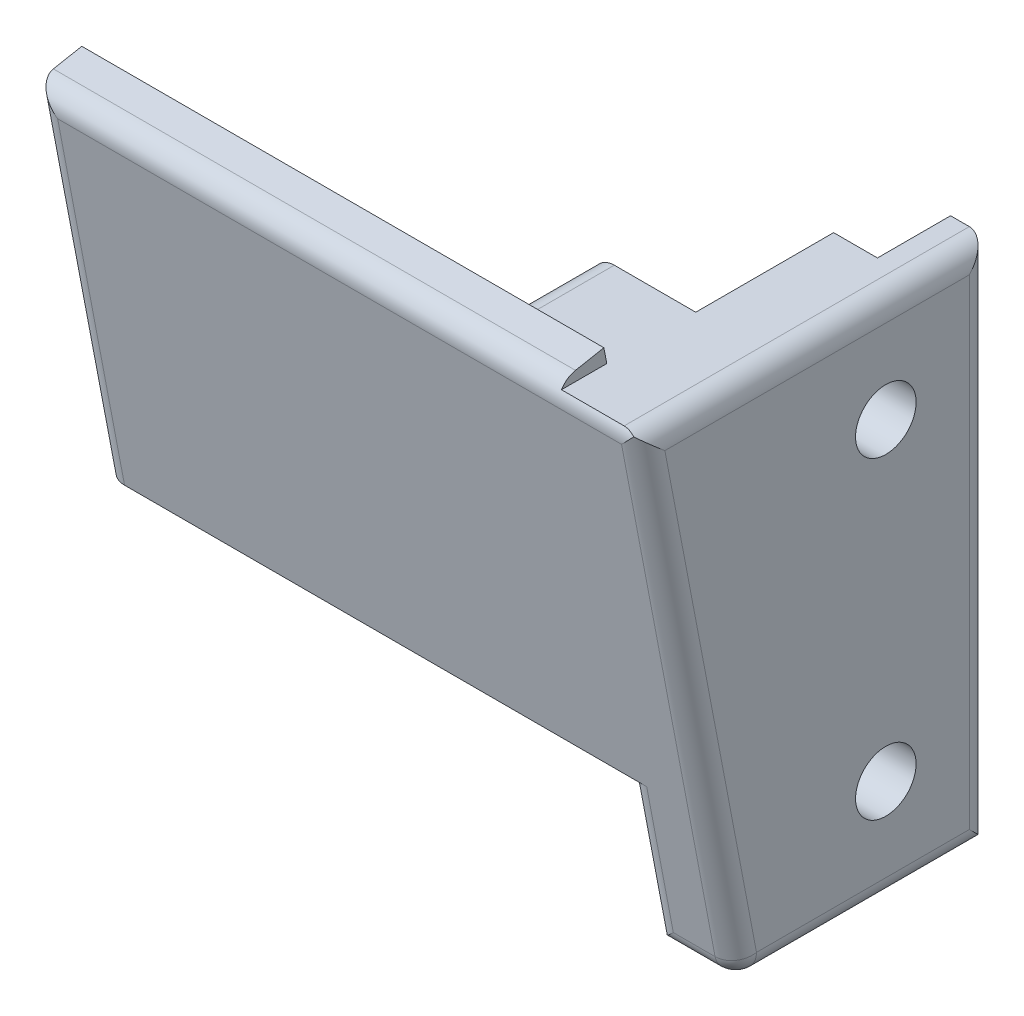
ISO-10303-21;
HEADER;
FILE_DESCRIPTION(('STEP AP214'),'2;1');
FILE_NAME('part.step','',(''),(''),'','','');
FILE_SCHEMA(('AUTOMOTIVE_DESIGN { 1 0 10303 214 1 1 1 1 }'));
ENDSEC;
DATA;
#1=APPLICATION_CONTEXT('core data for automotive mechanical design processes');
#2=APPLICATION_PROTOCOL_DEFINITION('international standard','automotive_design',2000,#1);
#3=PRODUCT_CONTEXT('',#1,'mechanical');
#4=PRODUCT('Part','Part','',(#3));
#5=PRODUCT_RELATED_PRODUCT_CATEGORY('part','',(#4));
#6=PRODUCT_DEFINITION_FORMATION('','',#4);
#7=PRODUCT_DEFINITION_CONTEXT('part definition',#1,'design');
#8=PRODUCT_DEFINITION('design','',#6,#7);
#9=PRODUCT_DEFINITION_SHAPE('','',#8);
#10=(LENGTH_UNIT() NAMED_UNIT(*) SI_UNIT(.MILLI.,.METRE.));
#11=(NAMED_UNIT(*) PLANE_ANGLE_UNIT() SI_UNIT($,.RADIAN.));
#12=(NAMED_UNIT(*) SI_UNIT($,.STERADIAN.) SOLID_ANGLE_UNIT());
#13=UNCERTAINTY_MEASURE_WITH_UNIT(LENGTH_MEASURE(1.E-05),#10,'distance_accuracy_value','');
#14=(GEOMETRIC_REPRESENTATION_CONTEXT(3) GLOBAL_UNCERTAINTY_ASSIGNED_CONTEXT((#13)) GLOBAL_UNIT_ASSIGNED_CONTEXT((#10,
#11,#12)) REPRESENTATION_CONTEXT('',''));
#15=CARTESIAN_POINT('',(0.,0.,0.));
#16=DIRECTION('',(0.,0.,1.));
#17=DIRECTION('',(1.,0.,0.));
#18=AXIS2_PLACEMENT_3D('',#15,#16,#17);
#19=CARTESIAN_POINT('',(50.,0.,0.));
#20=DIRECTION('',(-1.,0.,0.));
#21=DIRECTION('',(0.,0.,1.));
#22=AXIS2_PLACEMENT_3D('',#19,#20,#21);
#23=PLANE('',#22);
#24=DIRECTION('',(0.,-0.187368284578925,0.982289736245855));
#25=VECTOR('',#24,1.);
#26=CARTESIAN_POINT('',(50.,40.,17.6298581840024));
#27=LINE('',#26,#25);
#28=CARTESIAN_POINT('',(50.,41.4553683976997,10.));
#29=VERTEX_POINT('',#28);
#30=CARTESIAN_POINT('',(50.,40.9368414228946,12.7184095027731));
#31=VERTEX_POINT('',#30);
#32=EDGE_CURVE('E298',#29,#31,#27,.T.);
#33=ORIENTED_EDGE('',*,*,#32,.T.);
#34=CARTESIAN_POINT('',(50.,38.9722619504029,12.3436729336153));
#35=DIRECTION('',(-1.,0.,0.));
#36=DIRECTION('',(0.,0.,1.));
#37=AXIS2_PLACEMENT_3D('',#34,#35,#36);
#38=CIRCLE('',#37,2.);
#39=CARTESIAN_POINT('',(50.,40.,14.0594102390937));
#40=VERTEX_POINT('',#39);
#41=EDGE_CURVE('E370',#31,#40,#38,.F.);
#42=ORIENTED_EDGE('',*,*,#41,.T.);
#43=DIRECTION('',(0.,0.,-1.));
#44=VECTOR('',#43,1.);
#45=CARTESIAN_POINT('',(50.,40.,45.456648032545));
#46=LINE('',#45,#44);
#47=CARTESIAN_POINT('',(50.,40.,9.72239363800181));
#48=VERTEX_POINT('',#47);
#49=EDGE_CURVE('E291',#40,#48,#46,.T.);
#50=ORIENTED_EDGE('',*,*,#49,.T.);
#51=DIRECTION('',(0.,0.982289736245855,0.187368284578925));
#52=VECTOR('',#51,1.);
#53=CARTESIAN_POINT('',(50.,41.4553683976997,10.));
#54=LINE('',#53,#52);
#55=EDGE_CURVE('E296',#48,#29,#54,.T.);
#56=ORIENTED_EDGE('',*,*,#55,.T.);
#57=EDGE_LOOP('',(#33,#42,#50,#56));
#58=FACE_BOUND('',#57,.T.);
#59=ADVANCED_FACE('F41',(#58),#23,.F.);
#60=CARTESIAN_POINT('',(50.,40.,17.6298581840024));
#61=DIRECTION('',(0.,-0.982289736245855,-0.187368284578925));
#62=DIRECTION('',(0.,0.187368284578925,-0.982289736245855));
#63=AXIS2_PLACEMENT_3D('',#60,#61,#62);
#64=PLANE('',#63);
#65=DIRECTION('',(0.,-0.187368284578925,0.982289736245855));
#66=VECTOR('',#65,1.);
#67=CARTESIAN_POINT('',(0.,40.,17.6298581840024));
#68=LINE('',#67,#66);
#69=CARTESIAN_POINT('',(0.,41.4553683976997,10.));
#70=VERTEX_POINT('',#69);
#71=CARTESIAN_POINT('',(0.,40.9368414228946,12.7184095027731));
#72=VERTEX_POINT('',#71);
#73=EDGE_CURVE('E299',#70,#72,#68,.T.);
#74=ORIENTED_EDGE('',*,*,#73,.T.);
#75=DIRECTION('',(-1.,0.,0.));
#76=VECTOR('',#75,1.);
#77=CARTESIAN_POINT('',(50.,40.9368414228946,12.7184095027731));
#78=LINE('',#77,#76);
#79=EDGE_CURVE('E368',#72,#31,#78,.F.);
#80=ORIENTED_EDGE('',*,*,#79,.T.);
#81=ORIENTED_EDGE('',*,*,#32,.F.);
#82=DIRECTION('',(-1.,0.,0.));
#83=VECTOR('',#82,1.);
#84=CARTESIAN_POINT('',(50.,41.4553683976997,10.));
#85=LINE('',#84,#83);
#86=EDGE_CURVE('E302',#29,#70,#85,.T.);
#87=ORIENTED_EDGE('',*,*,#86,.T.);
#88=EDGE_LOOP('',(#74,#80,#81,#87));
#89=FACE_BOUND('',#88,.T.);
#90=ADVANCED_FACE('F430',(#89),#64,.F.);
#91=CARTESIAN_POINT('',(50.,40.,57.851648071345));
#92=DIRECTION('',(0.,1.,0.));
#93=DIRECTION('',(0.,0.,1.));
#94=AXIS2_PLACEMENT_3D('',#91,#92,#93);
#95=PLANE('',#94);
#96=DIRECTION('',(1.,0.,0.));
#97=VECTOR('',#96,1.);
#98=CARTESIAN_POINT('',(50.,40.,14.0594102390937));
#99=LINE('',#98,#97);
#100=CARTESIAN_POINT('',(56.,40.,14.0594102390937));
#101=VERTEX_POINT('',#100);
#102=EDGE_CURVE('E358',#40,#101,#99,.T.);
#103=ORIENTED_EDGE('',*,*,#102,.T.);
#104=DIRECTION('',(0.,0.,1.));
#105=VECTOR('',#104,1.);
#106=CARTESIAN_POINT('',(56.,40.,57.851648071345));
#107=LINE('',#106,#105);
#108=CARTESIAN_POINT('',(56.,40.,-19.));
#109=VERTEX_POINT('',#108);
#110=EDGE_CURVE('E360',#101,#109,#107,.F.);
#111=ORIENTED_EDGE('',*,*,#110,.T.);
#112=DIRECTION('',(1.,0.,0.));
#113=VECTOR('',#112,1.);
#114=CARTESIAN_POINT('',(50.,40.,-19.));
#115=LINE('',#114,#113);
#116=CARTESIAN_POINT('',(54.2,40.,-19.));
#117=VERTEX_POINT('',#116);
#118=EDGE_CURVE('E282',#117,#109,#115,.T.);
#119=ORIENTED_EDGE('',*,*,#118,.F.);
#120=DIRECTION('',(0.,0.,-1.));
#121=VECTOR('',#120,1.);
#122=CARTESIAN_POINT('',(54.2,40.,-19.));
#123=LINE('',#122,#121);
#124=CARTESIAN_POINT('',(54.2,40.,-12.));
#125=VERTEX_POINT('',#124);
#126=EDGE_CURVE('E277',#125,#117,#123,.T.);
#127=ORIENTED_EDGE('',*,*,#126,.F.);
#128=DIRECTION('',(-1.,0.,0.));
#129=VECTOR('',#128,1.);
#130=CARTESIAN_POINT('',(54.2,40.,-12.));
#131=LINE('',#130,#129);
#132=CARTESIAN_POINT('',(50.,40.,-12.));
#133=VERTEX_POINT('',#132);
#134=EDGE_CURVE('E203',#125,#133,#131,.T.);
#135=ORIENTED_EDGE('',*,*,#134,.T.);
#136=DIRECTION('',(0.,0.,-1.));
#137=VECTOR('',#136,1.);
#138=CARTESIAN_POINT('',(50.,40.,57.851648071345));
#139=LINE('',#138,#137);
#140=CARTESIAN_POINT('',(50.,40.,1.2));
#141=VERTEX_POINT('',#140);
#142=EDGE_CURVE('E195',#141,#133,#139,.T.);
#143=ORIENTED_EDGE('',*,*,#142,.F.);
#144=DIRECTION('',(-1.,0.,0.));
#145=VECTOR('',#144,1.);
#146=CARTESIAN_POINT('',(50.,40.,1.2));
#147=LINE('',#146,#145);
#148=CARTESIAN_POINT('',(42.2,40.,1.2));
#149=VERTEX_POINT('',#148);
#150=EDGE_CURVE('E200',#141,#149,#147,.T.);
#151=ORIENTED_EDGE('',*,*,#150,.T.);
#152=DIRECTION('',(0.,0.,1.));
#153=VECTOR('',#152,1.);
#154=CARTESIAN_POINT('',(42.2,40.,57.851648071345));
#155=LINE('',#154,#153);
#156=CARTESIAN_POINT('',(42.2,40.,9.72239363800181));
#157=VERTEX_POINT('',#156);
#158=EDGE_CURVE('E323',#149,#157,#155,.T.);
#159=ORIENTED_EDGE('',*,*,#158,.T.);
#160=DIRECTION('',(1.,0.,0.));
#161=VECTOR('',#160,1.);
#162=CARTESIAN_POINT('',(50.,40.,9.72239363800181));
#163=LINE('',#162,#161);
#164=EDGE_CURVE('E235',#157,#48,#163,.T.);
#165=ORIENTED_EDGE('',*,*,#164,.T.);
#166=ORIENTED_EDGE('',*,*,#49,.F.);
#167=EDGE_LOOP('',(#103,#111,#119,#127,#135,#143,#151,#159,#165,#166));
#168=FACE_BOUND('',#167,.T.);
#169=ADVANCED_FACE('F197',(#168),#95,.T.);
#170=CARTESIAN_POINT('',(10.,5.,-56.8276253029822));
#171=DIRECTION('',(0.,1.,0.));
#172=DIRECTION('',(0.,0.,1.));
#173=AXIS2_PLACEMENT_3D('',#170,#171,#172);
#174=PLANE('',#173);
#175=DIRECTION('',(-1.,0.,0.));
#176=VECTOR('',#175,1.);
#177=CARTESIAN_POINT('',(10.,5.,7.89964355629896));
#178=LINE('',#177,#176);
#179=CARTESIAN_POINT('',(52.,5.,7.89964355629896));
#180=VERTEX_POINT('',#179);
#181=CARTESIAN_POINT('',(2.,5.,7.89964355629896));
#182=VERTEX_POINT('',#181);
#183=EDGE_CURVE('E226',#180,#182,#178,.T.);
#184=ORIENTED_EDGE('',*,*,#183,.T.);
#185=CARTESIAN_POINT('',(2.,5.,5.8635844118314));
#186=DIRECTION('',(0.,1.,0.));
#187=DIRECTION('',(0.,0.,-1.));
#188=AXIS2_PLACEMENT_3D('',#185,#186,#187);
#189=ELLIPSE('',#188,2.03605914446756,2.);
#190=CARTESIAN_POINT('',(0.,5.,5.8635844118314));
#191=VERTEX_POINT('',#190);
#192=EDGE_CURVE('E364',#182,#191,#189,.F.);
#193=ORIENTED_EDGE('',*,*,#192,.T.);
#194=DIRECTION('',(0.,0.,1.));
#195=VECTOR('',#194,1.);
#196=CARTESIAN_POINT('',(0.,5.,4.));
#197=LINE('',#196,#195);
#198=CARTESIAN_POINT('',(0.,5.,4.));
#199=VERTEX_POINT('',#198);
#200=EDGE_CURVE('E244',#199,#191,#197,.T.);
#201=ORIENTED_EDGE('',*,*,#200,.F.);
#202=DIRECTION('',(1.,0.,0.));
#203=VECTOR('',#202,1.);
#204=CARTESIAN_POINT('',(10.,5.,4.));
#205=LINE('',#204,#203);
#206=CARTESIAN_POINT('',(42.2,5.,4.));
#207=VERTEX_POINT('',#206);
#208=EDGE_CURVE('E289',#199,#207,#205,.T.);
#209=ORIENTED_EDGE('',*,*,#208,.T.);
#210=DIRECTION('',(0.,0.,-1.));
#211=VECTOR('',#210,1.);
#212=CARTESIAN_POINT('',(42.2,5.,1.2));
#213=LINE('',#212,#211);
#214=CARTESIAN_POINT('',(42.2,5.,1.2));
#215=VERTEX_POINT('',#214);
#216=EDGE_CURVE('E308',#207,#215,#213,.T.);
#217=ORIENTED_EDGE('',*,*,#216,.T.);
#218=DIRECTION('',(1.,0.,0.));
#219=VECTOR('',#218,1.);
#220=CARTESIAN_POINT('',(50.,5.,1.2));
#221=LINE('',#220,#219);
#222=CARTESIAN_POINT('',(50.,5.,1.2));
#223=VERTEX_POINT('',#222);
#224=EDGE_CURVE('E232',#215,#223,#221,.T.);
#225=ORIENTED_EDGE('',*,*,#224,.T.);
#226=DIRECTION('',(0.,0.,-1.));
#227=VECTOR('',#226,1.);
#228=CARTESIAN_POINT('',(50.,5.,22.8062484748657));
#229=LINE('',#228,#227);
#230=CARTESIAN_POINT('',(50.,5.,5.8635844118314));
#231=VERTEX_POINT('',#230);
#232=EDGE_CURVE('E216',#231,#223,#229,.T.);
#233=ORIENTED_EDGE('',*,*,#232,.F.);
#234=CARTESIAN_POINT('',(52.,5.,5.8635844118314));
#235=DIRECTION('',(0.,1.,0.));
#236=DIRECTION('',(0.,0.,-1.));
#237=AXIS2_PLACEMENT_3D('',#234,#235,#236);
#238=ELLIPSE('',#237,2.03605914446756,2.);
#239=EDGE_CURVE('E372',#231,#180,#238,.T.);
#240=ORIENTED_EDGE('',*,*,#239,.T.);
#241=EDGE_LOOP('',(#184,#193,#201,#209,#217,#225,#233,#240));
#242=FACE_BOUND('',#241,.T.);
#243=ADVANCED_FACE('F446',(#242),#174,.F.);
#244=CARTESIAN_POINT('',(0.,0.,0.));
#245=DIRECTION('',(-1.,0.,0.));
#246=DIRECTION('',(0.,0.,1.));
#247=AXIS2_PLACEMENT_3D('',#244,#245,#246);
#248=PLANE('',#247);
#249=DIRECTION('',(0.,0.982289736245855,0.187368284578925));
#250=VECTOR('',#249,1.);
#251=CARTESIAN_POINT('',(0.,41.4553683976997,10.));
#252=LINE('',#251,#250);
#253=CARTESIAN_POINT('',(0.,10.4642357256726,4.08855131877073));
#254=VERTEX_POINT('',#253);
#255=EDGE_CURVE('E207',#254,#70,#252,.T.);
#256=ORIENTED_EDGE('',*,*,#255,.F.);
#257=CARTESIAN_POINT('',(0.,9.52739430277793,9.));
#258=DIRECTION('',(-1.,0.,0.));
#259=DIRECTION('',(0.,0.,1.));
#260=AXIS2_PLACEMENT_3D('',#257,#258,#259);
#261=CIRCLE('',#260,5.);
#262=CARTESIAN_POINT('',(0.,9.52739430277793,4.));
#263=VERTEX_POINT('',#262);
#264=EDGE_CURVE('E63',#254,#263,#261,.T.);
#265=ORIENTED_EDGE('',*,*,#264,.T.);
#266=DIRECTION('',(0.,1.,0.));
#267=VECTOR('',#266,1.);
#268=CARTESIAN_POINT('',(0.,-60.1597448159378,4.));
#269=LINE('',#268,#267);
#270=EDGE_CURVE('E208',#199,#263,#269,.T.);
#271=ORIENTED_EDGE('',*,*,#270,.F.);
#272=ORIENTED_EDGE('',*,*,#200,.T.);
#273=DIRECTION('',(0.,-0.982289736245855,-0.187368284578925));
#274=VECTOR('',#273,1.);
#275=CARTESIAN_POINT('',(0.,-0.90365800550408,4.73748257811023));
#276=LINE('',#275,#274);
#277=EDGE_CURVE('E366',#191,#72,#276,.F.);
#278=ORIENTED_EDGE('',*,*,#277,.T.);
#279=ORIENTED_EDGE('',*,*,#73,.F.);
#280=EDGE_LOOP('',(#256,#265,#271,#272,#278,#279));
#281=FACE_BOUND('',#280,.T.);
#282=ADVANCED_FACE('F443',(#281),#248,.T.);
#283=CARTESIAN_POINT('',(0.,-60.1597448159378,4.));
#284=DIRECTION('',(0.,0.,1.));
#285=DIRECTION('',(1.,0.,0.));
#286=AXIS2_PLACEMENT_3D('',#283,#284,#285);
#287=PLANE('',#286);
#288=ORIENTED_EDGE('',*,*,#270,.T.);
#289=DIRECTION('',(-1.,0.,0.));
#290=VECTOR('',#289,1.);
#291=CARTESIAN_POINT('',(0.,9.52739430277793,4.));
#292=LINE('',#291,#290);
#293=CARTESIAN_POINT('',(40.2,9.52739430277793,4.));
#294=VERTEX_POINT('',#293);
#295=EDGE_CURVE('E49',#263,#294,#292,.F.);
#296=ORIENTED_EDGE('',*,*,#295,.T.);
#297=DIRECTION('',(0.,-1.,0.));
#298=VECTOR('',#297,1.);
#299=CARTESIAN_POINT('',(40.2,-60.1597448159378,4.));
#300=LINE('',#299,#298);
#301=CARTESIAN_POINT('',(40.2,7.,4.));
#302=VERTEX_POINT('',#301);
#303=EDGE_CURVE('E241',#294,#302,#300,.T.);
#304=ORIENTED_EDGE('',*,*,#303,.T.);
#305=CARTESIAN_POINT('',(42.2,7.,4.));
#306=DIRECTION('',(0.,0.,1.));
#307=DIRECTION('',(1.,0.,0.));
#308=AXIS2_PLACEMENT_3D('',#305,#306,#307);
#309=CIRCLE('',#308,2.);
#310=EDGE_CURVE('E325',#302,#207,#309,.T.);
#311=ORIENTED_EDGE('',*,*,#310,.T.);
#312=ORIENTED_EDGE('',*,*,#208,.F.);
#313=EDGE_LOOP('',(#288,#296,#304,#311,#312));
#314=FACE_BOUND('',#313,.T.);
#315=ADVANCED_FACE('F445',(#314),#287,.F.);
#316=CARTESIAN_POINT('',(0.,0.,-19.));
#317=DIRECTION('',(0.,0.,-1.));
#318=DIRECTION('',(-1.,0.,0.));
#319=AXIS2_PLACEMENT_3D('',#316,#317,#318);
#320=PLANE('',#319);
#321=ORIENTED_EDGE('',*,*,#118,.T.);
#322=DIRECTION('',(0.,1.,0.));
#323=VECTOR('',#322,1.);
#324=CARTESIAN_POINT('',(56.,0.,-19.));
#325=LINE('',#324,#323);
#326=CARTESIAN_POINT('',(56.,-10.,-19.));
#327=VERTEX_POINT('',#326);
#328=EDGE_CURVE('E362',#109,#327,#325,.F.);
#329=ORIENTED_EDGE('',*,*,#328,.T.);
#330=DIRECTION('',(-1.,0.,0.));
#331=VECTOR('',#330,1.);
#332=CARTESIAN_POINT('',(55.,-10.,-19.));
#333=LINE('',#332,#331);
#334=CARTESIAN_POINT('',(54.2,-10.,-19.));
#335=VERTEX_POINT('',#334);
#336=EDGE_CURVE('E287',#327,#335,#333,.T.);
#337=ORIENTED_EDGE('',*,*,#336,.T.);
#338=DIRECTION('',(0.,-1.,0.));
#339=VECTOR('',#338,1.);
#340=CARTESIAN_POINT('',(54.2,40.,-19.));
#341=LINE('',#340,#339);
#342=EDGE_CURVE('E268',#117,#335,#341,.T.);
#343=ORIENTED_EDGE('',*,*,#342,.F.);
#344=EDGE_LOOP('',(#321,#329,#337,#343));
#345=FACE_BOUND('',#344,.T.);
#346=ADVANCED_FACE('F502',(#345),#320,.T.);
#347=CARTESIAN_POINT('',(0.,-10.,0.));
#348=DIRECTION('',(0.,-1.,0.));
#349=DIRECTION('',(0.,0.,-1.));
#350=AXIS2_PLACEMENT_3D('',#347,#348,#349);
#351=PLANE('',#350);
#352=DIRECTION('',(1.,0.,0.));
#353=VECTOR('',#352,1.);
#354=CARTESIAN_POINT('',(0.,-10.,3.38388050203061));
#355=LINE('',#354,#353);
#356=CARTESIAN_POINT('',(56.,-10.,3.38388050203061));
#357=VERTEX_POINT('',#356);
#358=CARTESIAN_POINT('',(50.0354205275083,-10.,3.38388050203061));
#359=VERTEX_POINT('',#358);
#360=EDGE_CURVE('E343',#357,#359,#355,.F.);
#361=ORIENTED_EDGE('',*,*,#360,.T.);
#362=CARTESIAN_POINT('',(52.,-10.,3.00238759283049));
#363=DIRECTION('',(0.,-1.,0.));
#364=DIRECTION('',(0.,0.,-1.));
#365=AXIS2_PLACEMENT_3D('',#362,#363,#364);
#366=ELLIPSE('',#365,2.03605914446756,2.);
#367=CARTESIAN_POINT('',(50.,-10.,3.00238759283049));
#368=VERTEX_POINT('',#367);
#369=EDGE_CURVE('E345',#359,#368,#366,.T.);
#370=ORIENTED_EDGE('',*,*,#369,.T.);
#371=DIRECTION('',(0.,0.,-1.));
#372=VECTOR('',#371,1.);
#373=CARTESIAN_POINT('',(50.,-10.,0.));
#374=LINE('',#373,#372);
#375=CARTESIAN_POINT('',(50.,-10.,-12.));
#376=VERTEX_POINT('',#375);
#377=EDGE_CURVE('E293',#368,#376,#374,.T.);
#378=ORIENTED_EDGE('',*,*,#377,.T.);
#379=DIRECTION('',(-1.,0.,0.));
#380=VECTOR('',#379,1.);
#381=CARTESIAN_POINT('',(54.2,-10.,-12.));
#382=LINE('',#381,#380);
#383=CARTESIAN_POINT('',(54.2,-10.,-12.));
#384=VERTEX_POINT('',#383);
#385=EDGE_CURVE('E279',#384,#376,#382,.T.);
#386=ORIENTED_EDGE('',*,*,#385,.F.);
#387=DIRECTION('',(0.,0.,1.));
#388=VECTOR('',#387,1.);
#389=CARTESIAN_POINT('',(54.2,-10.,-19.));
#390=LINE('',#389,#388);
#391=EDGE_CURVE('E271',#335,#384,#390,.T.);
#392=ORIENTED_EDGE('',*,*,#391,.F.);
#393=ORIENTED_EDGE('',*,*,#336,.F.);
#394=DIRECTION('',(0.,0.,-1.));
#395=VECTOR('',#394,1.);
#396=CARTESIAN_POINT('',(56.,-10.,0.));
#397=LINE('',#396,#395);
#398=EDGE_CURVE('E341',#327,#357,#397,.F.);
#399=ORIENTED_EDGE('',*,*,#398,.T.);
#400=EDGE_LOOP('',(#361,#370,#378,#386,#392,#393,#399));
#401=FACE_BOUND('',#400,.T.);
#402=ADVANCED_FACE('F441',(#401),#351,.T.);
#403=CARTESIAN_POINT('',(50.,41.4553683976997,10.));
#404=DIRECTION('',(0.,-0.187368284578925,0.982289736245855));
#405=DIRECTION('',(0.,-0.982289736245855,-0.187368284578925));
#406=AXIS2_PLACEMENT_3D('',#403,#404,#405);
#407=PLANE('',#406);
#408=DIRECTION('',(0.,-0.982289736245855,-0.187368284578925));
#409=VECTOR('',#408,1.);
#410=CARTESIAN_POINT('',(40.2,41.4553683976997,10.));
#411=LINE('',#410,#409);
#412=CARTESIAN_POINT('',(40.2,38.,9.34090072880169));
#413=VERTEX_POINT('',#412);
#414=CARTESIAN_POINT('',(40.2,10.4642357256726,4.08855131877073));
#415=VERTEX_POINT('',#414);
#416=EDGE_CURVE('E238',#413,#415,#411,.T.);
#417=ORIENTED_EDGE('',*,*,#416,.T.);
#418=DIRECTION('',(-1.,0.,0.));
#419=VECTOR('',#418,1.);
#420=CARTESIAN_POINT('',(50.,10.4642357256726,4.08855131877073));
#421=LINE('',#420,#419);
#422=EDGE_CURVE('E375',#415,#254,#421,.T.);
#423=ORIENTED_EDGE('',*,*,#422,.T.);
#424=ORIENTED_EDGE('',*,*,#255,.T.);
#425=ORIENTED_EDGE('',*,*,#86,.F.);
#426=ORIENTED_EDGE('',*,*,#55,.F.);
#427=ORIENTED_EDGE('',*,*,#164,.F.);
#428=CARTESIAN_POINT('',(42.2,38.,9.3409007288017));
#429=DIRECTION('',(0.,-0.187368284578925,0.982289736245855));
#430=DIRECTION('',(0.,0.982289736245855,0.187368284578925));
#431=AXIS2_PLACEMENT_3D('',#428,#429,#430);
#432=ELLIPSE('',#431,2.03605914446756,2.);
#433=EDGE_CURVE('E328',#157,#413,#432,.T.);
#434=ORIENTED_EDGE('',*,*,#433,.T.);
#435=EDGE_LOOP('',(#417,#423,#424,#425,#426,#427,#434));
#436=FACE_BOUND('',#435,.T.);
#437=ADVANCED_FACE('F448',(#436),#407,.F.);
#438=CARTESIAN_POINT('',(50.,40.,57.851648071345));
#439=DIRECTION('',(-1.,0.,0.));
#440=DIRECTION('',(0.,0.,1.));
#441=AXIS2_PLACEMENT_3D('',#438,#439,#440);
#442=PLANE('',#441);
#443=ORIENTED_EDGE('',*,*,#377,.F.);
#444=DIRECTION('',(0.,-0.982289736245855,-0.187368284578925));
#445=VECTOR('',#444,1.);
#446=CARTESIAN_POINT('',(50.,48.3396595525773,14.1304708150592));
#447=LINE('',#446,#445);
#448=EDGE_CURVE('E347',#368,#231,#447,.F.);
#449=ORIENTED_EDGE('',*,*,#448,.T.);
#450=ORIENTED_EDGE('',*,*,#232,.T.);
#451=DIRECTION('',(0.,1.,0.));
#452=VECTOR('',#451,1.);
#453=CARTESIAN_POINT('',(50.,-8.17118066082157,1.2));
#454=LINE('',#453,#452);
#455=EDGE_CURVE('E211',#223,#141,#454,.T.);
#456=ORIENTED_EDGE('',*,*,#455,.T.);
#457=ORIENTED_EDGE('',*,*,#142,.T.);
#458=DIRECTION('',(0.,1.,0.));
#459=VECTOR('',#458,1.);
#460=CARTESIAN_POINT('',(50.,40.,-12.));
#461=LINE('',#460,#459);
#462=EDGE_CURVE('E267',#376,#133,#461,.T.);
#463=ORIENTED_EDGE('',*,*,#462,.F.);
#464=EDGE_LOOP('',(#443,#449,#450,#456,#457,#463));
#465=FACE_BOUND('',#464,.T.);
#466=CARTESIAN_POINT('',(50.,30.,-9.));
#467=DIRECTION('',(-1.,0.,0.));
#468=DIRECTION('',(0.,0.,1.));
#469=AXIS2_PLACEMENT_3D('',#466,#467,#468);
#470=CIRCLE('',#469,1.5);
#471=CARTESIAN_POINT('',(50.,30.,-7.5));
#472=VERTEX_POINT('',#471);
#473=EDGE_CURVE('E263',#472,#472,#470,.T.);
#474=ORIENTED_EDGE('',*,*,#473,.F.);
#475=EDGE_LOOP('',(#474));
#476=FACE_BOUND('',#475,.T.);
#477=CARTESIAN_POINT('',(50.,0.,-9.00000000000001));
#478=DIRECTION('',(-1.,0.,0.));
#479=DIRECTION('',(0.,0.,1.));
#480=AXIS2_PLACEMENT_3D('',#477,#478,#479);
#481=CIRCLE('',#480,1.5);
#482=CARTESIAN_POINT('',(50.,0.,-7.5));
#483=VERTEX_POINT('',#482);
#484=EDGE_CURVE('E260',#483,#483,#481,.T.);
#485=ORIENTED_EDGE('',*,*,#484,.F.);
#486=EDGE_LOOP('',(#485));
#487=FACE_BOUND('',#486,.T.);
#488=ADVANCED_FACE('F213',(#465,#476,#487),#442,.T.);
#489=CARTESIAN_POINT('',(54.2,40.,-12.));
#490=DIRECTION('',(0.,0.,1.));
#491=DIRECTION('',(0.,-1.,0.));
#492=AXIS2_PLACEMENT_3D('',#489,#490,#491);
#493=PLANE('',#492);
#494=ORIENTED_EDGE('',*,*,#462,.T.);
#495=ORIENTED_EDGE('',*,*,#134,.F.);
#496=DIRECTION('',(0.,1.,0.));
#497=VECTOR('',#496,1.);
#498=CARTESIAN_POINT('',(54.2,40.,-12.));
#499=LINE('',#498,#497);
#500=EDGE_CURVE('E274',#384,#125,#499,.T.);
#501=ORIENTED_EDGE('',*,*,#500,.F.);
#502=ORIENTED_EDGE('',*,*,#385,.T.);
#503=EDGE_LOOP('',(#494,#495,#501,#502));
#504=FACE_BOUND('',#503,.T.);
#505=ADVANCED_FACE('F521',(#504),#493,.F.);
#506=CARTESIAN_POINT('',(54.2,0.,0.));
#507=DIRECTION('',(-1.,0.,0.));
#508=DIRECTION('',(0.,0.,1.));
#509=AXIS2_PLACEMENT_3D('',#506,#507,#508);
#510=PLANE('',#509);
#511=ORIENTED_EDGE('',*,*,#342,.T.);
#512=ORIENTED_EDGE('',*,*,#391,.T.);
#513=ORIENTED_EDGE('',*,*,#500,.T.);
#514=ORIENTED_EDGE('',*,*,#126,.T.);
#515=EDGE_LOOP('',(#511,#512,#513,#514));
#516=FACE_BOUND('',#515,.T.);
#517=ADVANCED_FACE('F505',(#516),#510,.T.);
#518=CARTESIAN_POINT('',(58.,0.,0.));
#519=DIRECTION('',(1.,0.,0.));
#520=DIRECTION('',(0.,0.,-1.));
#521=AXIS2_PLACEMENT_3D('',#518,#519,#520);
#522=PLANE('',#521);
#523=DIRECTION('',(0.,0.,1.));
#524=VECTOR('',#523,1.);
#525=CARTESIAN_POINT('',(58.,38.,0.));
#526=LINE('',#525,#524);
#527=CARTESIAN_POINT('',(58.,38.,-17.));
#528=VERTEX_POINT('',#527);
#529=CARTESIAN_POINT('',(58.,38.,12.1582174136334));
#530=VERTEX_POINT('',#529);
#531=EDGE_CURVE('E353',#528,#530,#526,.T.);
#532=ORIENTED_EDGE('',*,*,#531,.T.);
#533=DIRECTION('',(0.,0.982289736245855,0.187368284578925));
#534=VECTOR('',#533,1.);
#535=CARTESIAN_POINT('',(58.,-0.90365800550408,4.73748257811023));
#536=LINE('',#535,#534);
#537=CARTESIAN_POINT('',(58.,-8.,3.38388050203061));
#538=VERTEX_POINT('',#537);
#539=EDGE_CURVE('E355',#530,#538,#536,.F.);
#540=ORIENTED_EDGE('',*,*,#539,.T.);
#541=DIRECTION('',(0.,0.,-1.));
#542=VECTOR('',#541,1.);
#543=CARTESIAN_POINT('',(58.,-8.,0.));
#544=LINE('',#543,#542);
#545=CARTESIAN_POINT('',(58.,-8.,-17.));
#546=VERTEX_POINT('',#545);
#547=EDGE_CURVE('E351',#538,#546,#544,.T.);
#548=ORIENTED_EDGE('',*,*,#547,.T.);
#549=DIRECTION('',(0.,1.,0.));
#550=VECTOR('',#549,1.);
#551=CARTESIAN_POINT('',(58.,0.,-17.));
#552=LINE('',#551,#550);
#553=EDGE_CURVE('E349',#546,#528,#552,.T.);
#554=ORIENTED_EDGE('',*,*,#553,.T.);
#555=EDGE_LOOP('',(#532,#540,#548,#554));
#556=FACE_BOUND('',#555,.T.);
#557=CARTESIAN_POINT('',(58.,30.,-9.));
#558=DIRECTION('',(1.,0.,0.));
#559=DIRECTION('',(0.,0.,-1.));
#560=AXIS2_PLACEMENT_3D('',#557,#558,#559);
#561=CIRCLE('',#560,2.9);
#562=CARTESIAN_POINT('',(58.,30.,-11.9));
#563=VERTEX_POINT('',#562);
#564=EDGE_CURVE('E248',#563,#563,#561,.T.);
#565=ORIENTED_EDGE('',*,*,#564,.F.);
#566=EDGE_LOOP('',(#565));
#567=FACE_BOUND('',#566,.T.);
#568=CARTESIAN_POINT('',(58.,0.,-9.00000000000001));
#569=DIRECTION('',(1.,0.,0.));
#570=DIRECTION('',(0.,0.,-1.));
#571=AXIS2_PLACEMENT_3D('',#568,#569,#570);
#572=CIRCLE('',#571,2.9);
#573=CARTESIAN_POINT('',(58.,0.,-11.9));
#574=VERTEX_POINT('',#573);
#575=EDGE_CURVE('E247',#574,#574,#572,.T.);
#576=ORIENTED_EDGE('',*,*,#575,.F.);
#577=EDGE_LOOP('',(#576));
#578=FACE_BOUND('',#577,.T.);
#579=ADVANCED_FACE('F488',(#556,#567,#578),#522,.T.);
#580=CARTESIAN_POINT('',(45.,0.,-9.00000000000001));
#581=DIRECTION('',(1.,0.,0.));
#582=DIRECTION('',(0.,0.,-1.));
#583=AXIS2_PLACEMENT_3D('',#580,#581,#582);
#584=CYLINDRICAL_SURFACE('',#583,1.5);
#585=CARTESIAN_POINT('',(52.,0.,-9.00000000000001));
#586=DIRECTION('',(-1.,0.,0.));
#587=DIRECTION('',(0.,0.,1.));
#588=AXIS2_PLACEMENT_3D('',#585,#586,#587);
#589=CIRCLE('',#588,1.5);
#590=CARTESIAN_POINT('',(52.,0.,-7.5));
#591=VERTEX_POINT('',#590);
#592=EDGE_CURVE('E264',#591,#591,#589,.F.);
#593=ORIENTED_EDGE('',*,*,#592,.T.);
#594=EDGE_LOOP('',(#593));
#595=FACE_BOUND('',#594,.T.);
#596=ORIENTED_EDGE('',*,*,#484,.T.);
#597=EDGE_LOOP('',(#596));
#598=FACE_BOUND('',#597,.T.);
#599=ADVANCED_FACE('F570',(#595,#598),#584,.F.);
#600=CARTESIAN_POINT('',(45.,30.,-9.));
#601=DIRECTION('',(1.,0.,0.));
#602=DIRECTION('',(0.,0.,-1.));
#603=AXIS2_PLACEMENT_3D('',#600,#601,#602);
#604=CYLINDRICAL_SURFACE('',#603,1.5);
#605=CARTESIAN_POINT('',(52.,30.,-9.));
#606=DIRECTION('',(-1.,0.,0.));
#607=DIRECTION('',(0.,0.,1.));
#608=AXIS2_PLACEMENT_3D('',#605,#606,#607);
#609=CIRCLE('',#608,1.5);
#610=CARTESIAN_POINT('',(52.,30.,-7.5));
#611=VERTEX_POINT('',#610);
#612=EDGE_CURVE('E255',#611,#611,#609,.F.);
#613=ORIENTED_EDGE('',*,*,#612,.T.);
#614=EDGE_LOOP('',(#613));
#615=FACE_BOUND('',#614,.T.);
#616=ORIENTED_EDGE('',*,*,#473,.T.);
#617=EDGE_LOOP('',(#616));
#618=FACE_BOUND('',#617,.T.);
#619=ADVANCED_FACE('F768',(#615,#618),#604,.F.);
#620=CARTESIAN_POINT('',(52.,40.,57.851648071345));
#621=DIRECTION('',(-1.,0.,0.));
#622=DIRECTION('',(0.,0.,1.));
#623=AXIS2_PLACEMENT_3D('',#620,#621,#622);
#624=PLANE('',#623);
#625=CARTESIAN_POINT('',(52.,30.,-9.));
#626=DIRECTION('',(-1.,0.,0.));
#627=DIRECTION('',(0.,0.,1.));
#628=AXIS2_PLACEMENT_3D('',#625,#626,#627);
#629=CIRCLE('',#628,2.9);
#630=CARTESIAN_POINT('',(52.,30.,-6.1));
#631=VERTEX_POINT('',#630);
#632=EDGE_CURVE('E251',#631,#631,#629,.F.);
#633=ORIENTED_EDGE('',*,*,#632,.T.);
#634=EDGE_LOOP('',(#633));
#635=FACE_BOUND('',#634,.T.);
#636=ORIENTED_EDGE('',*,*,#612,.F.);
#637=EDGE_LOOP('',(#636));
#638=FACE_BOUND('',#637,.T.);
#639=ADVANCED_FACE('F758',(#635,#638),#624,.F.);
#640=CARTESIAN_POINT('',(41.7975613382361,30.,-9.));
#641=DIRECTION('',(1.,0.,0.));
#642=DIRECTION('',(0.,0.,-1.));
#643=AXIS2_PLACEMENT_3D('',#640,#641,#642);
#644=CYLINDRICAL_SURFACE('',#643,2.9);
#645=ORIENTED_EDGE('',*,*,#564,.T.);
#646=EDGE_LOOP('',(#645));
#647=FACE_BOUND('',#646,.T.);
#648=ORIENTED_EDGE('',*,*,#632,.F.);
#649=EDGE_LOOP('',(#648));
#650=FACE_BOUND('',#649,.T.);
#651=ADVANCED_FACE('F748',(#647,#650),#644,.F.);
#652=CARTESIAN_POINT('',(52.,40.,57.851648071345));
#653=DIRECTION('',(-1.,0.,0.));
#654=DIRECTION('',(0.,0.,1.));
#655=AXIS2_PLACEMENT_3D('',#652,#653,#654);
#656=PLANE('',#655);
#657=CARTESIAN_POINT('',(52.,0.,-9.00000000000001));
#658=DIRECTION('',(-1.,0.,0.));
#659=DIRECTION('',(0.,0.,1.));
#660=AXIS2_PLACEMENT_3D('',#657,#658,#659);
#661=CIRCLE('',#660,2.9);
#662=CARTESIAN_POINT('',(52.,0.,-6.1));
#663=VERTEX_POINT('',#662);
#664=EDGE_CURVE('E252',#663,#663,#661,.F.);
#665=ORIENTED_EDGE('',*,*,#664,.T.);
#666=EDGE_LOOP('',(#665));
#667=FACE_BOUND('',#666,.T.);
#668=ORIENTED_EDGE('',*,*,#592,.F.);
#669=EDGE_LOOP('',(#668));
#670=FACE_BOUND('',#669,.T.);
#671=ADVANCED_FACE('F739',(#667,#670),#656,.F.);
#672=CARTESIAN_POINT('',(41.7975613382361,0.,-9.00000000000001));
#673=DIRECTION('',(1.,0.,0.));
#674=DIRECTION('',(0.,0.,-1.));
#675=AXIS2_PLACEMENT_3D('',#672,#673,#674);
#676=CYLINDRICAL_SURFACE('',#675,2.9);
#677=ORIENTED_EDGE('',*,*,#575,.T.);
#678=EDGE_LOOP('',(#677));
#679=FACE_BOUND('',#678,.T.);
#680=ORIENTED_EDGE('',*,*,#664,.F.);
#681=EDGE_LOOP('',(#680));
#682=FACE_BOUND('',#681,.T.);
#683=ADVANCED_FACE('F652',(#679,#682),#676,.F.);
#684=CARTESIAN_POINT('',(40.2,-8.17118066082157,1.2));
#685=DIRECTION('',(-1.,0.,0.));
#686=DIRECTION('',(0.,0.,1.));
#687=AXIS2_PLACEMENT_3D('',#684,#685,#686);
#688=PLANE('',#687);
#689=DIRECTION('',(0.,1.,0.));
#690=VECTOR('',#689,1.);
#691=CARTESIAN_POINT('',(40.2,-8.17118066082157,1.2));
#692=LINE('',#691,#690);
#693=CARTESIAN_POINT('',(40.2,7.,1.2));
#694=VERTEX_POINT('',#693);
#695=CARTESIAN_POINT('',(40.2,38.,1.2));
#696=VERTEX_POINT('',#695);
#697=EDGE_CURVE('E220',#694,#696,#692,.T.);
#698=ORIENTED_EDGE('',*,*,#697,.F.);
#699=DIRECTION('',(0.,0.,-1.));
#700=VECTOR('',#699,1.);
#701=CARTESIAN_POINT('',(40.2,7.,4.));
#702=LINE('',#701,#700);
#703=EDGE_CURVE('E320',#694,#302,#702,.F.);
#704=ORIENTED_EDGE('',*,*,#703,.T.);
#705=ORIENTED_EDGE('',*,*,#303,.F.);
#706=CARTESIAN_POINT('',(40.2,9.52739430277793,9.));
#707=DIRECTION('',(-1.,0.,0.));
#708=DIRECTION('',(0.,0.,1.));
#709=AXIS2_PLACEMENT_3D('',#706,#707,#708);
#710=CIRCLE('',#709,5.);
#711=EDGE_CURVE('E12',#294,#415,#710,.F.);
#712=ORIENTED_EDGE('',*,*,#711,.T.);
#713=ORIENTED_EDGE('',*,*,#416,.F.);
#714=DIRECTION('',(0.,0.,1.));
#715=VECTOR('',#714,1.);
#716=CARTESIAN_POINT('',(40.2,38.,1.2));
#717=LINE('',#716,#715);
#718=EDGE_CURVE('E318',#413,#696,#717,.F.);
#719=ORIENTED_EDGE('',*,*,#718,.T.);
#720=EDGE_LOOP('',(#698,#704,#705,#712,#713,#719));
#721=FACE_BOUND('',#720,.T.);
#722=ADVANCED_FACE('F648',(#721),#688,.T.);
#723=CARTESIAN_POINT('',(50.,-8.17118066082157,1.2));
#724=DIRECTION('',(0.,0.,-1.));
#725=DIRECTION('',(-1.,0.,0.));
#726=AXIS2_PLACEMENT_3D('',#723,#724,#725);
#727=PLANE('',#726);
#728=ORIENTED_EDGE('',*,*,#224,.F.);
#729=CARTESIAN_POINT('',(42.2,7.,1.2));
#730=DIRECTION('',(0.,0.,-1.));
#731=DIRECTION('',(-1.,0.,0.));
#732=AXIS2_PLACEMENT_3D('',#729,#730,#731);
#733=CIRCLE('',#732,2.);
#734=EDGE_CURVE('E316',#215,#694,#733,.T.);
#735=ORIENTED_EDGE('',*,*,#734,.T.);
#736=ORIENTED_EDGE('',*,*,#697,.T.);
#737=CARTESIAN_POINT('',(42.2,38.,1.2));
#738=DIRECTION('',(0.,0.,-1.));
#739=DIRECTION('',(-1.,0.,0.));
#740=AXIS2_PLACEMENT_3D('',#737,#738,#739);
#741=CIRCLE('',#740,2.);
#742=EDGE_CURVE('E225',#696,#149,#741,.T.);
#743=ORIENTED_EDGE('',*,*,#742,.T.);
#744=ORIENTED_EDGE('',*,*,#150,.F.);
#745=ORIENTED_EDGE('',*,*,#455,.F.);
#746=EDGE_LOOP('',(#728,#735,#736,#743,#744,#745));
#747=FACE_BOUND('',#746,.T.);
#748=ADVANCED_FACE('F222',(#747),#727,.T.);
#749=CARTESIAN_POINT('',(0.,-1.27839457466193,6.70206205060194));
#750=DIRECTION('',(0.,-0.187368284578925,0.982289736245855));
#751=DIRECTION('',(0.,-0.982289736245855,-0.187368284578925));
#752=AXIS2_PLACEMENT_3D('',#749,#750,#751);
#753=PLANE('',#752);
#754=ORIENTED_EDGE('',*,*,#183,.F.);
#755=DIRECTION('',(0.,-0.982289736245855,-0.187368284578925));
#756=VECTOR('',#755,1.);
#757=CARTESIAN_POINT('',(52.,-1.27839457466193,6.70206205060194));
#758=LINE('',#757,#756);
#759=CARTESIAN_POINT('',(52.,-8.37473656915785,5.34845997452233));
#760=VERTEX_POINT('',#759);
#761=EDGE_CURVE('E338',#180,#760,#758,.T.);
#762=ORIENTED_EDGE('',*,*,#761,.T.);
#763=DIRECTION('',(1.,0.,0.));
#764=VECTOR('',#763,1.);
#765=CARTESIAN_POINT('',(0.,-8.37473656915785,5.34845997452233));
#766=LINE('',#765,#764);
#767=CARTESIAN_POINT('',(56.,-8.37473656915785,5.34845997452233));
#768=VERTEX_POINT('',#767);
#769=EDGE_CURVE('E336',#760,#768,#766,.T.);
#770=ORIENTED_EDGE('',*,*,#769,.T.);
#771=DIRECTION('',(0.,0.982289736245855,0.187368284578925));
#772=VECTOR('',#771,1.);
#773=CARTESIAN_POINT('',(56.,-1.27839457466193,6.70206205060194));
#774=LINE('',#773,#772);
#775=CARTESIAN_POINT('',(56.,38.5975253812451,14.308252406107));
#776=VERTEX_POINT('',#775);
#777=EDGE_CURVE('E334',#768,#776,#774,.T.);
#778=ORIENTED_EDGE('',*,*,#777,.T.);
#779=DIRECTION('',(-1.,0.,0.));
#780=VECTOR('',#779,1.);
#781=CARTESIAN_POINT('',(0.,38.5975253812451,14.308252406107));
#782=LINE('',#781,#780);
#783=CARTESIAN_POINT('',(2.,38.5975253812451,14.308252406107));
#784=VERTEX_POINT('',#783);
#785=EDGE_CURVE('E330',#776,#784,#782,.T.);
#786=ORIENTED_EDGE('',*,*,#785,.T.);
#787=DIRECTION('',(0.,-0.982289736245855,-0.187368284578925));
#788=VECTOR('',#787,1.);
#789=CARTESIAN_POINT('',(2.,-1.27839457466193,6.70206205060194));
#790=LINE('',#789,#788);
#791=EDGE_CURVE('E332',#784,#182,#790,.T.);
#792=ORIENTED_EDGE('',*,*,#791,.T.);
#793=EDGE_LOOP('',(#754,#762,#770,#778,#786,#792));
#794=FACE_BOUND('',#793,.T.);
#795=ADVANCED_FACE('F453',(#794),#753,.T.);
#796=CARTESIAN_POINT('',(42.2,7.,-56.8276253029822));
#797=DIRECTION('',(0.,0.,1.));
#798=DIRECTION('',(1.,0.,0.));
#799=AXIS2_PLACEMENT_3D('',#796,#797,#798);
#800=CYLINDRICAL_SURFACE('',#799,2.);
#801=ORIENTED_EDGE('',*,*,#310,.F.);
#802=ORIENTED_EDGE('',*,*,#703,.F.);
#803=ORIENTED_EDGE('',*,*,#734,.F.);
#804=ORIENTED_EDGE('',*,*,#216,.F.);
#805=EDGE_LOOP('',(#801,#802,#803,#804));
#806=FACE_BOUND('',#805,.T.);
#807=ADVANCED_FACE('F425',(#806),#800,.T.);
#808=CARTESIAN_POINT('',(42.2,38.,57.851648071345));
#809=DIRECTION('',(0.,0.,1.));
#810=DIRECTION('',(1.,0.,0.));
#811=AXIS2_PLACEMENT_3D('',#808,#809,#810);
#812=CYLINDRICAL_SURFACE('',#811,2.);
#813=ORIENTED_EDGE('',*,*,#742,.F.);
#814=ORIENTED_EDGE('',*,*,#718,.F.);
#815=ORIENTED_EDGE('',*,*,#433,.F.);
#816=ORIENTED_EDGE('',*,*,#158,.F.);
#817=EDGE_LOOP('',(#813,#814,#815,#816));
#818=FACE_BOUND('',#817,.T.);
#819=ADVANCED_FACE('F420',(#818),#812,.T.);
#820=CARTESIAN_POINT('',(2.,-0.90365800550408,4.73748257811023));
#821=DIRECTION('',(0.,-0.982289736245855,-0.187368284578925));
#822=DIRECTION('',(0.,0.187368284578925,-0.982289736245855));
#823=AXIS2_PLACEMENT_3D('',#820,#821,#822);
#824=CYLINDRICAL_SURFACE('',#823,2.);
#825=ORIENTED_EDGE('',*,*,#192,.F.);
#826=ORIENTED_EDGE('',*,*,#791,.F.);
#827=CARTESIAN_POINT('',(2.,38.9722619504029,12.3436729336153));
#828=DIRECTION('',(0.707106781186547,0.694583733589389,0.132489384605049));
#829=DIRECTION('',(0.707106781186547,-0.694583733589389,-0.132489384605049));
#830=AXIS2_PLACEMENT_3D('',#827,#828,#829);
#831=ELLIPSE('',#830,2.82842712474619,2.);
#832=EDGE_CURVE('E229',#72,#784,#831,.T.);
#833=ORIENTED_EDGE('',*,*,#832,.F.);
#834=ORIENTED_EDGE('',*,*,#277,.F.);
#835=EDGE_LOOP('',(#825,#826,#833,#834));
#836=FACE_BOUND('',#835,.T.);
#837=ADVANCED_FACE('F414',(#836),#824,.T.);
#838=CARTESIAN_POINT('',(0.,38.9722619504029,12.3436729336153));
#839=DIRECTION('',(1.,0.,0.));
#840=DIRECTION('',(0.,0.,-1.));
#841=AXIS2_PLACEMENT_3D('',#838,#839,#840);
#842=CYLINDRICAL_SURFACE('',#841,2.);
#843=CARTESIAN_POINT('',(56.,40.,14.0594102390937));
#844=CARTESIAN_POINT('',(56.0533312371199,40.0000101577559,14.0593825722372));
#845=CARTESIAN_POINT('',(56.1066491972576,39.9978672711901,14.0606874197414));
#846=CARTESIAN_POINT('',(56.2127816168253,39.9893578262568,14.0657530645478));
#847=CARTESIAN_POINT('',(56.2655964970708,39.9829951839043,14.0695115847437));
#848=CARTESIAN_POINT('',(56.3699927163418,39.9661852932994,14.0792432575699));
#849=CARTESIAN_POINT('',(56.4215799753338,39.9557659055641,14.0852012904393));
#850=CARTESIAN_POINT('',(56.5235371273138,39.9309748451658,14.0989708114653));
#851=CARTESIAN_POINT('',(56.5739067737561,39.9166023792451,14.1067826715832));
#852=CARTESIAN_POINT('',(56.7223940025037,39.8678761946418,14.1323100620349));
#853=CARTESIAN_POINT('',(56.8183370470861,39.827840173258,14.1521654998018));
#854=CARTESIAN_POINT('',(57.0027651288234,39.733562230679,14.1938281878884));
#855=CARTESIAN_POINT('',(57.0912275728958,39.6792791737109,14.215640967668));
#856=CARTESIAN_POINT('',(57.2670128696259,39.5516337623118,14.2592162235469));
#857=CARTESIAN_POINT('',(57.3534349243257,39.4769516402336,14.2807784245288));
#858=CARTESIAN_POINT('',(57.5128297028219,39.3131250167222,14.3161762398259));
#859=CARTESIAN_POINT('',(57.5858535127809,39.2240379935443,14.3300416292517));
#860=CARTESIAN_POINT('',(57.6786214415668,39.0884262350134,14.3407152121526));
#861=CARTESIAN_POINT('',(57.7049523840055,39.0466977120092,14.3427434670026));
#862=CARTESIAN_POINT('',(57.7544762672826,38.9613743510225,14.3440975726809));
#863=CARTESIAN_POINT('',(57.7776703321037,38.9177801889319,14.3434243941326));
#864=CARTESIAN_POINT('',(57.8209307166143,38.8286649623773,14.3390140792462));
#865=CARTESIAN_POINT('',(57.8409630531989,38.78312887543,14.33524604283));
#866=CARTESIAN_POINT('',(57.8775012306284,38.6909889690396,14.3243432948577));
#867=CARTESIAN_POINT('',(57.8940024155205,38.6443838285168,14.3172041776732));
#868=CARTESIAN_POINT('',(57.90865487157,38.5975253812451,14.308252406107));
#869=B_SPLINE_CURVE_WITH_KNOTS('',3,(#843,#844,#845,#846,#847,#848,#849,#850,#851,#852,#853,
#854,#855,#856,#857,#858,#859,#860,#861,#862,#863,#864,#865,#866,#867,#868),.UNSPECIFIED.,.F.,
.F.,(4,2,2,2,2,2,2,2,2,2,2,2,4),(0.,0.159913163102716,0.319678130968876,0.4783647033297,
0.637083142325003,0.953169739883947,1.27017921775116,1.61720133394167,1.96287146951765,
2.11085328083091,2.25878192712579,2.40820575724631,2.55782541048827),.UNSPECIFIED.);
#870=CARTESIAN_POINT('',(57.0601634925204,39.6958930889437,14.2081723236217));
#871=VERTEX_POINT('',#870);
#872=EDGE_CURVE('E398',#101,#871,#869,.T.);
#873=ORIENTED_EDGE('',*,*,#872,.F.);
#874=ORIENTED_EDGE('',*,*,#102,.F.);
#875=ORIENTED_EDGE('',*,*,#41,.F.);
#876=ORIENTED_EDGE('',*,*,#79,.F.);
#877=ORIENTED_EDGE('',*,*,#832,.T.);
#878=ORIENTED_EDGE('',*,*,#785,.F.);
#879=CARTESIAN_POINT('',(56.,38.9722619504029,12.3436729336153));
#880=DIRECTION('',(-0.707106781186547,0.694583733589389,0.132489384605049));
#881=DIRECTION('',(0.707106781186547,0.694583733589389,0.132489384605049));
#882=AXIS2_PLACEMENT_3D('',#879,#880,#881);
#883=ELLIPSE('',#882,2.82842712474619,2.);
#884=EDGE_CURVE('E392',#871,#776,#883,.F.);
#885=ORIENTED_EDGE('',*,*,#884,.F.);
#886=EDGE_LOOP('',(#873,#874,#875,#876,#877,#878,#885));
#887=FACE_BOUND('',#886,.T.);
#888=ADVANCED_FACE('F409',(#887),#842,.T.);
#889=CARTESIAN_POINT('',(56.,38.,0.));
#890=DIRECTION('',(0.,0.,1.));
#891=DIRECTION('',(1.,0.,0.));
#892=AXIS2_PLACEMENT_3D('',#889,#890,#891);
#893=CYLINDRICAL_SURFACE('',#892,2.);
#894=CARTESIAN_POINT('',(56.,38.,12.1582174136334));
#895=DIRECTION('',(0.,-0.770509015060474,0.637429100144116));
#896=DIRECTION('',(0.,0.637429100144116,0.770509015060475));
#897=AXIS2_PLACEMENT_3D('',#894,#895,#896);
#898=ELLIPSE('',#897,3.13760385201714,2.);
#899=EDGE_CURVE('E389',#530,#871,#898,.T.);
#900=ORIENTED_EDGE('',*,*,#899,.F.);
#901=ORIENTED_EDGE('',*,*,#531,.F.);
#902=CARTESIAN_POINT('',(56.,38.,-17.));
#903=DIRECTION('',(0.,0.707106781186547,0.707106781186547));
#904=DIRECTION('',(0.,0.707106781186547,-0.707106781186547));
#905=AXIS2_PLACEMENT_3D('',#902,#903,#904);
#906=ELLIPSE('',#905,2.82842712474619,2.);
#907=EDGE_CURVE('E395',#109,#528,#906,.F.);
#908=ORIENTED_EDGE('',*,*,#907,.F.);
#909=ORIENTED_EDGE('',*,*,#110,.F.);
#910=ORIENTED_EDGE('',*,*,#872,.T.);
#911=EDGE_LOOP('',(#900,#901,#908,#909,#910));
#912=FACE_BOUND('',#911,.T.);
#913=ADVANCED_FACE('F413',(#912),#893,.T.);
#914=CARTESIAN_POINT('',(56.,0.,-17.));
#915=DIRECTION('',(0.,1.,0.));
#916=DIRECTION('',(0.,0.,1.));
#917=AXIS2_PLACEMENT_3D('',#914,#915,#916);
#918=CYLINDRICAL_SURFACE('',#917,2.);
#919=ORIENTED_EDGE('',*,*,#907,.T.);
#920=ORIENTED_EDGE('',*,*,#553,.F.);
#921=CARTESIAN_POINT('',(56.,-8.,-17.));
#922=DIRECTION('',(0.,0.707106781186547,-0.707106781186547));
#923=DIRECTION('',(0.,0.707106781186547,0.707106781186547));
#924=AXIS2_PLACEMENT_3D('',#921,#922,#923);
#925=ELLIPSE('',#924,2.82842712474619,2.);
#926=EDGE_CURVE('E386',#327,#546,#925,.F.);
#927=ORIENTED_EDGE('',*,*,#926,.F.);
#928=ORIENTED_EDGE('',*,*,#328,.F.);
#929=EDGE_LOOP('',(#919,#920,#927,#928));
#930=FACE_BOUND('',#929,.T.);
#931=ADVANCED_FACE('F417',(#930),#918,.T.);
#932=CARTESIAN_POINT('',(56.,-0.90365800550408,4.73748257811023));
#933=DIRECTION('',(0.,0.982289736245855,0.187368284578925));
#934=DIRECTION('',(0.,-0.187368284578925,0.982289736245855));
#935=AXIS2_PLACEMENT_3D('',#932,#933,#934);
#936=CYLINDRICAL_SURFACE('',#935,2.);
#937=ORIENTED_EDGE('',*,*,#884,.T.);
#938=ORIENTED_EDGE('',*,*,#777,.F.);
#939=CARTESIAN_POINT('',(56.,-8.,3.38388050203061));
#940=DIRECTION('',(0.,-0.982289736245855,-0.187368284578925));
#941=DIRECTION('',(0.,0.187368284578925,-0.982289736245855));
#942=AXIS2_PLACEMENT_3D('',#939,#940,#941);
#943=CIRCLE('',#942,2.);
#944=EDGE_CURVE('E383',#538,#768,#943,.T.);
#945=ORIENTED_EDGE('',*,*,#944,.F.);
#946=ORIENTED_EDGE('',*,*,#539,.F.);
#947=ORIENTED_EDGE('',*,*,#899,.T.);
#948=EDGE_LOOP('',(#937,#938,#945,#946,#947));
#949=FACE_BOUND('',#948,.T.);
#950=ADVANCED_FACE('F471',(#949),#936,.T.);
#951=CARTESIAN_POINT('',(56.,-8.,0.));
#952=DIRECTION('',(0.,0.,-1.));
#953=DIRECTION('',(-1.,0.,0.));
#954=AXIS2_PLACEMENT_3D('',#951,#952,#953);
#955=CYLINDRICAL_SURFACE('',#954,2.);
#956=ORIENTED_EDGE('',*,*,#926,.T.);
#957=ORIENTED_EDGE('',*,*,#547,.F.);
#958=CARTESIAN_POINT('',(56.,-8.,3.38388050203061));
#959=DIRECTION('',(0.,0.,1.));
#960=DIRECTION('',(1.,0.,0.));
#961=AXIS2_PLACEMENT_3D('',#958,#959,#960);
#962=CIRCLE('',#961,2.);
#963=EDGE_CURVE('E381',#357,#538,#962,.T.);
#964=ORIENTED_EDGE('',*,*,#963,.F.);
#965=ORIENTED_EDGE('',*,*,#398,.F.);
#966=EDGE_LOOP('',(#956,#957,#964,#965));
#967=FACE_BOUND('',#966,.T.);
#968=ADVANCED_FACE('F467',(#967),#955,.T.);
#969=CARTESIAN_POINT('',(56.,-8.,3.38388050203062));
#970=DIRECTION('',(1.,0.,0.));
#971=DIRECTION('',(0.,0.,-1.));
#972=AXIS2_PLACEMENT_3D('',#969,#970,#971);
#973=SPHERICAL_SURFACE('',#972,2.);
#974=ORIENTED_EDGE('',*,*,#963,.T.);
#975=ORIENTED_EDGE('',*,*,#944,.T.);
#976=CARTESIAN_POINT('',(56.,-8.,3.38388050203062));
#977=DIRECTION('',(1.,0.,0.));
#978=DIRECTION('',(0.,0.,-1.));
#979=AXIS2_PLACEMENT_3D('',#976,#977,#978);
#980=CIRCLE('',#979,2.);
#981=EDGE_CURVE('E378',#357,#768,#980,.F.);
#982=ORIENTED_EDGE('',*,*,#981,.F.);
#983=EDGE_LOOP('',(#974,#975,#982));
#984=FACE_BOUND('',#983,.T.);
#985=ADVANCED_FACE('F463',(#984),#973,.T.);
#986=CARTESIAN_POINT('',(0.,-8.,3.38388050203061));
#987=DIRECTION('',(1.,0.,0.));
#988=DIRECTION('',(0.,0.,-1.));
#989=AXIS2_PLACEMENT_3D('',#986,#987,#988);
#990=CYLINDRICAL_SURFACE('',#989,2.);
#991=ORIENTED_EDGE('',*,*,#981,.T.);
#992=ORIENTED_EDGE('',*,*,#769,.F.);
#993=CARTESIAN_POINT('',(52.,-8.,3.38388050203061));
#994=DIRECTION('',(0.707106781186547,-0.694583733589389,-0.132489384605049));
#995=DIRECTION('',(0.707106781186547,0.694583733589389,0.132489384605049));
#996=AXIS2_PLACEMENT_3D('',#993,#994,#995);
#997=ELLIPSE('',#996,2.82842712474619,2.);
#998=EDGE_CURVE('E376',#359,#760,#997,.F.);
#999=ORIENTED_EDGE('',*,*,#998,.F.);
#1000=ORIENTED_EDGE('',*,*,#360,.F.);
#1001=EDGE_LOOP('',(#991,#992,#999,#1000));
#1002=FACE_BOUND('',#1001,.T.);
#1003=ADVANCED_FACE('F459',(#1002),#990,.T.);
#1004=CARTESIAN_POINT('',(52.,-0.90365800550408,4.73748257811023));
#1005=DIRECTION('',(0.,-0.982289736245855,-0.187368284578925));
#1006=DIRECTION('',(0.,0.187368284578925,-0.982289736245855));
#1007=AXIS2_PLACEMENT_3D('',#1004,#1005,#1006);
#1008=CYLINDRICAL_SURFACE('',#1007,2.);
#1009=ORIENTED_EDGE('',*,*,#239,.F.);
#1010=ORIENTED_EDGE('',*,*,#448,.F.);
#1011=ORIENTED_EDGE('',*,*,#369,.F.);
#1012=ORIENTED_EDGE('',*,*,#998,.T.);
#1013=ORIENTED_EDGE('',*,*,#761,.F.);
#1014=EDGE_LOOP('',(#1009,#1010,#1011,#1012,#1013));
#1015=FACE_BOUND('',#1014,.T.);
#1016=ADVANCED_FACE('F456',(#1015),#1008,.T.);
#1017=CARTESIAN_POINT('',(50.,9.52739430277793,9.));
#1018=DIRECTION('',(-1.,0.,0.));
#1019=DIRECTION('',(0.,0.,1.));
#1020=AXIS2_PLACEMENT_3D('',#1017,#1018,#1019);
#1021=CYLINDRICAL_SURFACE('',#1020,5.);
#1022=ORIENTED_EDGE('',*,*,#711,.F.);
#1023=ORIENTED_EDGE('',*,*,#295,.F.);
#1024=ORIENTED_EDGE('',*,*,#264,.F.);
#1025=ORIENTED_EDGE('',*,*,#422,.F.);
#1026=EDGE_LOOP('',(#1022,#1023,#1024,#1025));
#1027=FACE_BOUND('',#1026,.T.);
#1028=ADVANCED_FACE('F43',(#1027),#1021,.T.);
#1029=CLOSED_SHELL('',(#59,#90,#169,#243,#282,#315,#346,#402,#437,#488,#505,#517,#579,#599,#619,
#639,#651,#671,#683,#722,#748,#795,#807,#819,#837,#888,#913,#931,#950,#968,#985,#1003,#1016,#1028));
#1030=MANIFOLD_SOLID_BREP('B2',#1029);
#1031=ADVANCED_BREP_SHAPE_REPRESENTATION('',(#18,#1030),#14);
#1032=SHAPE_DEFINITION_REPRESENTATION(#9,#1031);
ENDSEC;
END-ISO-10303-21;
